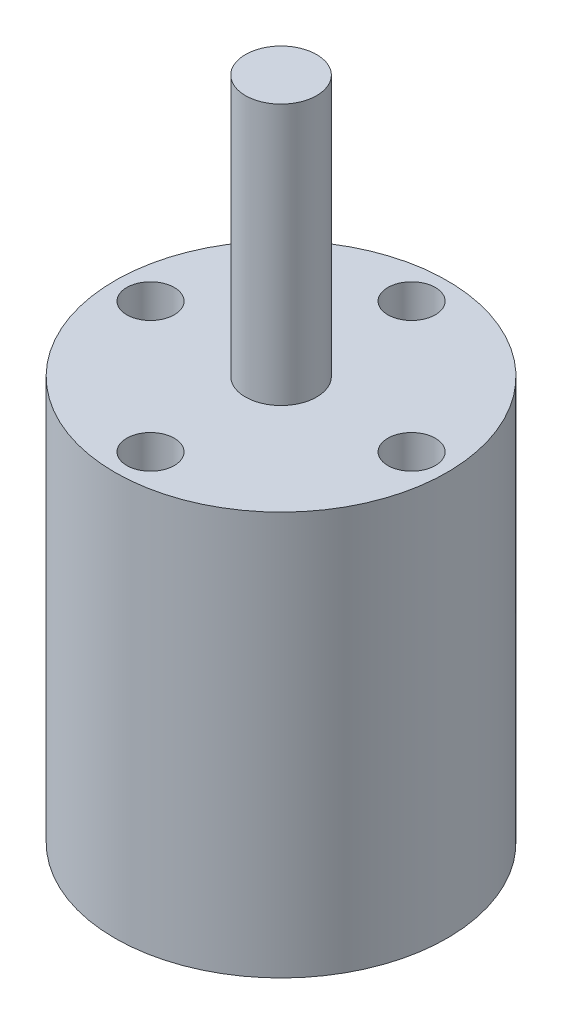
ISO-10303-21;
HEADER;
FILE_DESCRIPTION(('STEP AP214'),'2;1');
FILE_NAME('part.step','',(''),(''),'','','');
FILE_SCHEMA(('AUTOMOTIVE_DESIGN { 1 0 10303 214 1 1 1 1 }'));
ENDSEC;
DATA;
#1=APPLICATION_CONTEXT('core data for automotive mechanical design processes');
#2=APPLICATION_PROTOCOL_DEFINITION('international standard','automotive_design',2000,#1);
#3=PRODUCT_CONTEXT('',#1,'mechanical');
#4=PRODUCT('Part','Part','',(#3));
#5=PRODUCT_RELATED_PRODUCT_CATEGORY('part','',(#4));
#6=PRODUCT_DEFINITION_FORMATION('','',#4);
#7=PRODUCT_DEFINITION_CONTEXT('part definition',#1,'design');
#8=PRODUCT_DEFINITION('design','',#6,#7);
#9=PRODUCT_DEFINITION_SHAPE('','',#8);
#10=(LENGTH_UNIT() NAMED_UNIT(*) SI_UNIT(.MILLI.,.METRE.));
#11=(NAMED_UNIT(*) PLANE_ANGLE_UNIT() SI_UNIT($,.RADIAN.));
#12=(NAMED_UNIT(*) SI_UNIT($,.STERADIAN.) SOLID_ANGLE_UNIT());
#13=UNCERTAINTY_MEASURE_WITH_UNIT(LENGTH_MEASURE(1.E-05),#10,'distance_accuracy_value','');
#14=(GEOMETRIC_REPRESENTATION_CONTEXT(3) GLOBAL_UNCERTAINTY_ASSIGNED_CONTEXT((#13)) GLOBAL_UNIT_ASSIGNED_CONTEXT((#10,
#11,#12)) REPRESENTATION_CONTEXT('',''));
#15=CARTESIAN_POINT('',(0.,0.,0.));
#16=DIRECTION('',(0.,0.,1.));
#17=DIRECTION('',(1.,0.,0.));
#18=AXIS2_PLACEMENT_3D('',#15,#16,#17);
#19=CARTESIAN_POINT('',(0.,17.,0.));
#20=DIRECTION('',(0.,-1.,0.));
#21=DIRECTION('',(0.,0.,-1.));
#22=AXIS2_PLACEMENT_3D('',#19,#20,#21);
#23=CYLINDRICAL_SURFACE('',#22,7.);
#24=CARTESIAN_POINT('',(0.,17.,0.));
#25=DIRECTION('',(0.,1.,0.));
#26=DIRECTION('',(0.,0.,1.));
#27=AXIS2_PLACEMENT_3D('',#24,#25,#26);
#28=CIRCLE('',#27,7.);
#29=CARTESIAN_POINT('',(0.,17.,7.));
#30=VERTEX_POINT('',#29);
#31=EDGE_CURVE('E51',#30,#30,#28,.T.);
#32=ORIENTED_EDGE('',*,*,#31,.F.);
#33=EDGE_LOOP('',(#32));
#34=FACE_BOUND('',#33,.T.);
#35=CARTESIAN_POINT('',(0.,0.,0.));
#36=DIRECTION('',(0.,1.,0.));
#37=DIRECTION('',(0.,0.,1.));
#38=AXIS2_PLACEMENT_3D('',#35,#36,#37);
#39=CIRCLE('',#38,7.);
#40=CARTESIAN_POINT('',(0.,0.,7.));
#41=VERTEX_POINT('',#40);
#42=EDGE_CURVE('E46',#41,#41,#39,.T.);
#43=ORIENTED_EDGE('',*,*,#42,.T.);
#44=EDGE_LOOP('',(#43));
#45=FACE_BOUND('',#44,.T.);
#46=ADVANCED_FACE('F43',(#34,#45),#23,.T.);
#47=CARTESIAN_POINT('',(0.,17.,0.));
#48=DIRECTION('',(0.,1.,0.));
#49=DIRECTION('',(0.,0.,1.));
#50=AXIS2_PLACEMENT_3D('',#47,#48,#49);
#51=PLANE('',#50);
#52=CARTESIAN_POINT('',(-5.5,17.,0.));
#53=DIRECTION('',(0.,1.,0.));
#54=DIRECTION('',(0.,0.,1.));
#55=AXIS2_PLACEMENT_3D('',#52,#53,#54);
#56=CIRCLE('',#55,1.);
#57=CARTESIAN_POINT('',(-5.5,17.,0.999999999999999));
#58=VERTEX_POINT('',#57);
#59=EDGE_CURVE('E87',#58,#58,#56,.T.);
#60=ORIENTED_EDGE('',*,*,#59,.F.);
#61=EDGE_LOOP('',(#60));
#62=FACE_BOUND('',#61,.T.);
#63=CARTESIAN_POINT('',(0.,17.,5.5));
#64=DIRECTION('',(0.,1.,0.));
#65=DIRECTION('',(0.,0.,1.));
#66=AXIS2_PLACEMENT_3D('',#63,#64,#65);
#67=CIRCLE('',#66,1.);
#68=CARTESIAN_POINT('',(0.,17.,6.5));
#69=VERTEX_POINT('',#68);
#70=EDGE_CURVE('E83',#69,#69,#67,.T.);
#71=ORIENTED_EDGE('',*,*,#70,.F.);
#72=EDGE_LOOP('',(#71));
#73=FACE_BOUND('',#72,.T.);
#74=CARTESIAN_POINT('',(0.,17.,-5.5));
#75=DIRECTION('',(0.,1.,0.));
#76=DIRECTION('',(0.,0.,1.));
#77=AXIS2_PLACEMENT_3D('',#74,#75,#76);
#78=CIRCLE('',#77,1.00000000000001);
#79=CARTESIAN_POINT('',(0.,17.,-4.49999999999999));
#80=VERTEX_POINT('',#79);
#81=EDGE_CURVE('E75',#80,#80,#78,.T.);
#82=ORIENTED_EDGE('',*,*,#81,.F.);
#83=EDGE_LOOP('',(#82));
#84=FACE_BOUND('',#83,.T.);
#85=CARTESIAN_POINT('',(5.5,17.,0.));
#86=DIRECTION('',(0.,1.,0.));
#87=DIRECTION('',(0.,0.,1.));
#88=AXIS2_PLACEMENT_3D('',#85,#86,#87);
#89=CIRCLE('',#88,1.00000000000002);
#90=CARTESIAN_POINT('',(5.5,17.,1.00000000000002));
#91=VERTEX_POINT('',#90);
#92=EDGE_CURVE('E67',#91,#91,#89,.T.);
#93=ORIENTED_EDGE('',*,*,#92,.F.);
#94=EDGE_LOOP('',(#93));
#95=FACE_BOUND('',#94,.T.);
#96=CARTESIAN_POINT('',(0.,17.,0.));
#97=DIRECTION('',(0.,1.,0.));
#98=DIRECTION('',(0.,0.,1.));
#99=AXIS2_PLACEMENT_3D('',#96,#97,#98);
#100=CIRCLE('',#99,1.5);
#101=CARTESIAN_POINT('',(0.,17.,1.5));
#102=VERTEX_POINT('',#101);
#103=EDGE_CURVE('E10',#102,#102,#100,.T.);
#104=ORIENTED_EDGE('',*,*,#103,.F.);
#105=EDGE_LOOP('',(#104));
#106=FACE_BOUND('',#105,.T.);
#107=ORIENTED_EDGE('',*,*,#31,.T.);
#108=EDGE_LOOP('',(#107));
#109=FACE_BOUND('',#108,.T.);
#110=ADVANCED_FACE('F104',(#62,#73,#84,#95,#106,#109),#51,.T.);
#111=CARTESIAN_POINT('',(0.,0.,0.));
#112=DIRECTION('',(0.,1.,0.));
#113=DIRECTION('',(0.,0.,1.));
#114=AXIS2_PLACEMENT_3D('',#111,#112,#113);
#115=PLANE('',#114);
#116=ORIENTED_EDGE('',*,*,#42,.F.);
#117=EDGE_LOOP('',(#116));
#118=FACE_BOUND('',#117,.T.);
#119=ADVANCED_FACE('F107',(#118),#115,.F.);
#120=CARTESIAN_POINT('',(0.,28.,0.));
#121=DIRECTION('',(0.,-1.,0.));
#122=DIRECTION('',(0.,0.,-1.));
#123=AXIS2_PLACEMENT_3D('',#120,#121,#122);
#124=CYLINDRICAL_SURFACE('',#123,1.5);
#125=CARTESIAN_POINT('',(0.,28.,0.));
#126=DIRECTION('',(0.,1.,0.));
#127=DIRECTION('',(0.,0.,1.));
#128=AXIS2_PLACEMENT_3D('',#125,#126,#127);
#129=CIRCLE('',#128,1.5);
#130=CARTESIAN_POINT('',(0.,28.,1.5));
#131=VERTEX_POINT('',#130);
#132=EDGE_CURVE('E58',#131,#131,#129,.T.);
#133=ORIENTED_EDGE('',*,*,#132,.F.);
#134=EDGE_LOOP('',(#133));
#135=FACE_BOUND('',#134,.T.);
#136=ORIENTED_EDGE('',*,*,#103,.T.);
#137=EDGE_LOOP('',(#136));
#138=FACE_BOUND('',#137,.T.);
#139=ADVANCED_FACE('F125',(#135,#138),#124,.T.);
#140=CARTESIAN_POINT('',(0.,28.,0.));
#141=DIRECTION('',(0.,1.,0.));
#142=DIRECTION('',(0.,0.,1.));
#143=AXIS2_PLACEMENT_3D('',#140,#141,#142);
#144=PLANE('',#143);
#145=ORIENTED_EDGE('',*,*,#132,.T.);
#146=EDGE_LOOP('',(#145));
#147=FACE_BOUND('',#146,.T.);
#148=ADVANCED_FACE('F129',(#147),#144,.T.);
#149=CARTESIAN_POINT('',(5.5,12.,0.));
#150=DIRECTION('',(0.,1.,0.));
#151=DIRECTION('',(0.,0.,1.));
#152=AXIS2_PLACEMENT_3D('',#149,#150,#151);
#153=CYLINDRICAL_SURFACE('',#152,1.00000000000002);
#154=CARTESIAN_POINT('',(5.5,12.,0.));
#155=DIRECTION('',(0.,1.,0.));
#156=DIRECTION('',(0.,0.,1.));
#157=AXIS2_PLACEMENT_3D('',#154,#155,#156);
#158=CIRCLE('',#157,1.00000000000002);
#159=CARTESIAN_POINT('',(5.5,12.,1.00000000000002));
#160=VERTEX_POINT('',#159);
#161=EDGE_CURVE('E63',#160,#160,#158,.T.);
#162=ORIENTED_EDGE('',*,*,#161,.F.);
#163=EDGE_LOOP('',(#162));
#164=FACE_BOUND('',#163,.T.);
#165=ORIENTED_EDGE('',*,*,#92,.T.);
#166=EDGE_LOOP('',(#165));
#167=FACE_BOUND('',#166,.T.);
#168=ADVANCED_FACE('F135',(#164,#167),#153,.F.);
#169=CARTESIAN_POINT('',(5.5,12.,0.));
#170=DIRECTION('',(0.,1.,0.));
#171=DIRECTION('',(0.,0.,1.));
#172=AXIS2_PLACEMENT_3D('',#169,#170,#171);
#173=PLANE('',#172);
#174=ORIENTED_EDGE('',*,*,#161,.T.);
#175=EDGE_LOOP('',(#174));
#176=FACE_BOUND('',#175,.T.);
#177=ADVANCED_FACE('F137',(#176),#173,.T.);
#178=CARTESIAN_POINT('',(0.,12.,-5.5));
#179=DIRECTION('',(0.,1.,0.));
#180=DIRECTION('',(0.,0.,1.));
#181=AXIS2_PLACEMENT_3D('',#178,#179,#180);
#182=CYLINDRICAL_SURFACE('',#181,1.00000000000001);
#183=CARTESIAN_POINT('',(0.,12.,-5.5));
#184=DIRECTION('',(0.,1.,0.));
#185=DIRECTION('',(0.,0.,1.));
#186=AXIS2_PLACEMENT_3D('',#183,#184,#185);
#187=CIRCLE('',#186,1.00000000000001);
#188=CARTESIAN_POINT('',(0.,12.,-4.49999999999999));
#189=VERTEX_POINT('',#188);
#190=EDGE_CURVE('E71',#189,#189,#187,.T.);
#191=ORIENTED_EDGE('',*,*,#190,.F.);
#192=EDGE_LOOP('',(#191));
#193=FACE_BOUND('',#192,.T.);
#194=ORIENTED_EDGE('',*,*,#81,.T.);
#195=EDGE_LOOP('',(#194));
#196=FACE_BOUND('',#195,.T.);
#197=ADVANCED_FACE('F140',(#193,#196),#182,.F.);
#198=CARTESIAN_POINT('',(0.,12.,-5.5));
#199=DIRECTION('',(0.,1.,0.));
#200=DIRECTION('',(0.,0.,1.));
#201=AXIS2_PLACEMENT_3D('',#198,#199,#200);
#202=PLANE('',#201);
#203=ORIENTED_EDGE('',*,*,#190,.T.);
#204=EDGE_LOOP('',(#203));
#205=FACE_BOUND('',#204,.T.);
#206=ADVANCED_FACE('F145',(#205),#202,.T.);
#207=CARTESIAN_POINT('',(0.,12.,5.5));
#208=DIRECTION('',(0.,1.,0.));
#209=DIRECTION('',(0.,0.,1.));
#210=AXIS2_PLACEMENT_3D('',#207,#208,#209);
#211=CYLINDRICAL_SURFACE('',#210,1.);
#212=CARTESIAN_POINT('',(0.,12.,5.5));
#213=DIRECTION('',(0.,1.,0.));
#214=DIRECTION('',(0.,0.,1.));
#215=AXIS2_PLACEMENT_3D('',#212,#213,#214);
#216=CIRCLE('',#215,1.);
#217=CARTESIAN_POINT('',(0.,12.,6.5));
#218=VERTEX_POINT('',#217);
#219=EDGE_CURVE('E79',#218,#218,#216,.T.);
#220=ORIENTED_EDGE('',*,*,#219,.F.);
#221=EDGE_LOOP('',(#220));
#222=FACE_BOUND('',#221,.T.);
#223=ORIENTED_EDGE('',*,*,#70,.T.);
#224=EDGE_LOOP('',(#223));
#225=FACE_BOUND('',#224,.T.);
#226=ADVANCED_FACE('F148',(#222,#225),#211,.F.);
#227=CARTESIAN_POINT('',(0.,12.,5.5));
#228=DIRECTION('',(0.,1.,0.));
#229=DIRECTION('',(0.,0.,1.));
#230=AXIS2_PLACEMENT_3D('',#227,#228,#229);
#231=PLANE('',#230);
#232=ORIENTED_EDGE('',*,*,#219,.T.);
#233=EDGE_LOOP('',(#232));
#234=FACE_BOUND('',#233,.T.);
#235=ADVANCED_FACE('F100',(#234),#231,.T.);
#236=CARTESIAN_POINT('',(-5.5,12.,0.));
#237=DIRECTION('',(0.,1.,0.));
#238=DIRECTION('',(0.,0.,1.));
#239=AXIS2_PLACEMENT_3D('',#236,#237,#238);
#240=CYLINDRICAL_SURFACE('',#239,1.);
#241=CARTESIAN_POINT('',(-5.5,12.,0.));
#242=DIRECTION('',(0.,1.,0.));
#243=DIRECTION('',(0.,0.,1.));
#244=AXIS2_PLACEMENT_3D('',#241,#242,#243);
#245=CIRCLE('',#244,1.);
#246=CARTESIAN_POINT('',(-5.5,12.,0.999999999999999));
#247=VERTEX_POINT('',#246);
#248=EDGE_CURVE('E62',#247,#247,#245,.T.);
#249=ORIENTED_EDGE('',*,*,#248,.F.);
#250=EDGE_LOOP('',(#249));
#251=FACE_BOUND('',#250,.T.);
#252=ORIENTED_EDGE('',*,*,#59,.T.);
#253=EDGE_LOOP('',(#252));
#254=FACE_BOUND('',#253,.T.);
#255=ADVANCED_FACE('F97',(#251,#254),#240,.F.);
#256=CARTESIAN_POINT('',(-5.5,12.,0.));
#257=DIRECTION('',(0.,1.,0.));
#258=DIRECTION('',(0.,0.,1.));
#259=AXIS2_PLACEMENT_3D('',#256,#257,#258);
#260=PLANE('',#259);
#261=ORIENTED_EDGE('',*,*,#248,.T.);
#262=EDGE_LOOP('',(#261));
#263=FACE_BOUND('',#262,.T.);
#264=ADVANCED_FACE('F95',(#263),#260,.T.);
#265=CLOSED_SHELL('',(#46,#110,#119,#139,#148,#168,#177,#197,#206,#226,#235,#255,#264));
#266=MANIFOLD_SOLID_BREP('B2',#265);
#267=ADVANCED_BREP_SHAPE_REPRESENTATION('',(#18,#266),#14);
#268=SHAPE_DEFINITION_REPRESENTATION(#9,#267);
ENDSEC;
END-ISO-10303-21;
